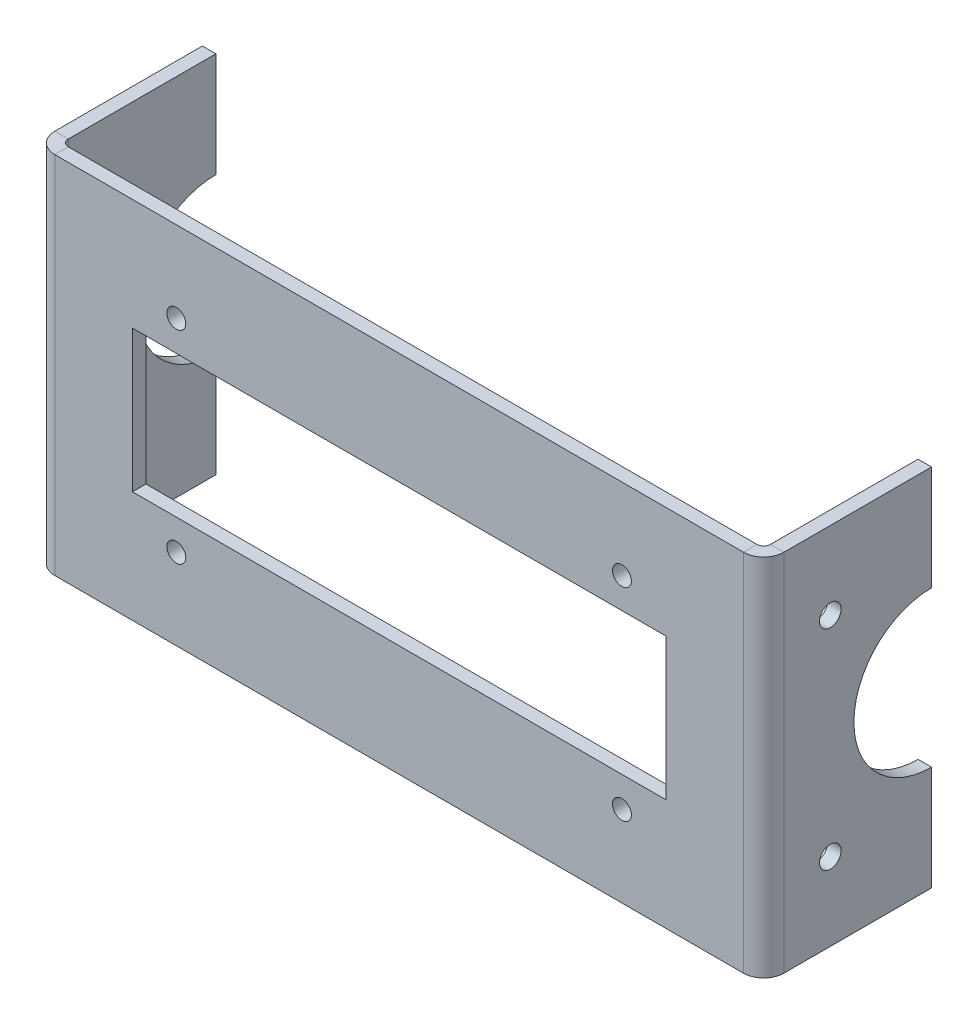
ISO-10303-21;
HEADER;
FILE_DESCRIPTION(('STEP AP214'),'2;1');
FILE_NAME('part.step','',(''),(''),'','','');
FILE_SCHEMA(('AUTOMOTIVE_DESIGN { 1 0 10303 214 1 1 1 1 }'));
ENDSEC;
DATA;
#1=APPLICATION_CONTEXT('core data for automotive mechanical design processes');
#2=APPLICATION_PROTOCOL_DEFINITION('international standard','automotive_design',2000,#1);
#3=PRODUCT_CONTEXT('',#1,'mechanical');
#4=PRODUCT('Part','Part','',(#3));
#5=PRODUCT_RELATED_PRODUCT_CATEGORY('part','',(#4));
#6=PRODUCT_DEFINITION_FORMATION('','',#4);
#7=PRODUCT_DEFINITION_CONTEXT('part definition',#1,'design');
#8=PRODUCT_DEFINITION('design','',#6,#7);
#9=PRODUCT_DEFINITION_SHAPE('','',#8);
#10=(LENGTH_UNIT() NAMED_UNIT(*) SI_UNIT(.MILLI.,.METRE.));
#11=(NAMED_UNIT(*) PLANE_ANGLE_UNIT() SI_UNIT($,.RADIAN.));
#12=(NAMED_UNIT(*) SI_UNIT($,.STERADIAN.) SOLID_ANGLE_UNIT());
#13=UNCERTAINTY_MEASURE_WITH_UNIT(LENGTH_MEASURE(1.E-05),#10,'distance_accuracy_value','');
#14=(GEOMETRIC_REPRESENTATION_CONTEXT(3) GLOBAL_UNCERTAINTY_ASSIGNED_CONTEXT((#13)) GLOBAL_UNIT_ASSIGNED_CONTEXT((#10,
#11,#12)) REPRESENTATION_CONTEXT('',''));
#15=CARTESIAN_POINT('',(0.,0.,0.));
#16=DIRECTION('',(0.,0.,1.));
#17=DIRECTION('',(1.,0.,0.));
#18=AXIS2_PLACEMENT_3D('',#15,#16,#17);
#19=CARTESIAN_POINT('',(74.4681720297526,-26.0653851394223,2.));
#20=DIRECTION('',(0.,1.,0.));
#21=DIRECTION('',(1.,0.,0.));
#22=AXIS2_PLACEMENT_3D('',#19,#20,#21);
#23=PLANE('',#22);
#24=DIRECTION('',(1.,0.,0.));
#25=VECTOR('',#24,1.);
#26=CARTESIAN_POINT('',(74.4681720297526,-26.0653851394223,2.));
#27=LINE('',#26,#25);
#28=CARTESIAN_POINT('',(-52.5318279702474,-26.0653851394223,2.));
#29=VERTEX_POINT('',#28);
#30=CARTESIAN_POINT('',(49.4681720297526,-26.0653851394223,2.));
#31=VERTEX_POINT('',#30);
#32=EDGE_CURVE('E49',#29,#31,#27,.T.);
#33=ORIENTED_EDGE('',*,*,#32,.F.);
#34=DIRECTION('',(0.,0.,-1.));
#35=VECTOR('',#34,1.);
#36=CARTESIAN_POINT('',(-52.5318279702474,-26.0653851394223,2.));
#37=LINE('',#36,#35);
#38=CARTESIAN_POINT('',(-52.5318279702474,-26.0653851394223,0.));
#39=VERTEX_POINT('',#38);
#40=EDGE_CURVE('E12',#29,#39,#37,.T.);
#41=ORIENTED_EDGE('',*,*,#40,.T.);
#42=DIRECTION('',(-1.,0.,0.));
#43=VECTOR('',#42,1.);
#44=CARTESIAN_POINT('',(-77.5318279702473,-26.0653851394223,0.));
#45=LINE('',#44,#43);
#46=CARTESIAN_POINT('',(49.4681720297526,-26.0653851394223,0.));
#47=VERTEX_POINT('',#46);
#48=EDGE_CURVE('E246',#39,#47,#45,.F.);
#49=ORIENTED_EDGE('',*,*,#48,.T.);
#50=DIRECTION('',(0.,0.,-1.));
#51=VECTOR('',#50,1.);
#52=CARTESIAN_POINT('',(49.4681720297526,-26.0653851394223,2.));
#53=LINE('',#52,#51);
#54=EDGE_CURVE('E238',#31,#47,#53,.T.);
#55=ORIENTED_EDGE('',*,*,#54,.F.);
#56=EDGE_LOOP('',(#33,#41,#49,#55));
#57=FACE_BOUND('',#56,.T.);
#58=ADVANCED_FACE('F46',(#57),#23,.F.);
#59=CARTESIAN_POINT('',(-77.5318279702473,0.934614860577672,0.));
#60=DIRECTION('',(0.,0.,-1.));
#61=DIRECTION('',(-1.,0.,0.));
#62=AXIS2_PLACEMENT_3D('',#59,#60,#61);
#63=PLANE('',#62);
#64=CARTESIAN_POINT('',(31.4681720297527,-14.0653851394223,0.));
#65=DIRECTION('',(0.,0.,1.));
#66=DIRECTION('',(1.,0.,0.));
#67=AXIS2_PLACEMENT_3D('',#64,#65,#66);
#68=CIRCLE('',#67,1.4);
#69=CARTESIAN_POINT('',(32.8681720297527,-14.0653851394223,0.));
#70=VERTEX_POINT('',#69);
#71=EDGE_CURVE('E243',#70,#70,#68,.T.);
#72=ORIENTED_EDGE('',*,*,#71,.T.);
#73=EDGE_LOOP('',(#72));
#74=FACE_BOUND('',#73,.T.);
#75=CARTESIAN_POINT('',(-34.5318279702473,-14.0653851394223,0.));
#76=DIRECTION('',(0.,0.,1.));
#77=DIRECTION('',(1.,0.,0.));
#78=AXIS2_PLACEMENT_3D('',#75,#76,#77);
#79=CIRCLE('',#78,1.4);
#80=CARTESIAN_POINT('',(-33.1318279702473,-14.0653851394223,0.));
#81=VERTEX_POINT('',#80);
#82=EDGE_CURVE('E247',#81,#81,#79,.T.);
#83=ORIENTED_EDGE('',*,*,#82,.T.);
#84=EDGE_LOOP('',(#83));
#85=FACE_BOUND('',#84,.T.);
#86=CARTESIAN_POINT('',(31.4681720297526,15.9346148605777,0.));
#87=DIRECTION('',(0.,0.,1.));
#88=DIRECTION('',(1.,0.,0.));
#89=AXIS2_PLACEMENT_3D('',#86,#87,#88);
#90=CIRCLE('',#89,1.4);
#91=CARTESIAN_POINT('',(32.8681720297526,15.9346148605777,0.));
#92=VERTEX_POINT('',#91);
#93=EDGE_CURVE('E250',#92,#92,#90,.T.);
#94=ORIENTED_EDGE('',*,*,#93,.T.);
#95=EDGE_LOOP('',(#94));
#96=FACE_BOUND('',#95,.T.);
#97=CARTESIAN_POINT('',(-34.5318279702474,15.9346148605777,0.));
#98=DIRECTION('',(0.,0.,1.));
#99=DIRECTION('',(1.,0.,0.));
#100=AXIS2_PLACEMENT_3D('',#97,#98,#99);
#101=CIRCLE('',#100,1.4);
#102=CARTESIAN_POINT('',(-33.1318279702474,15.9346148605777,0.));
#103=VERTEX_POINT('',#102);
#104=EDGE_CURVE('E253',#103,#103,#101,.T.);
#105=ORIENTED_EDGE('',*,*,#104,.T.);
#106=EDGE_LOOP('',(#105));
#107=FACE_BOUND('',#106,.T.);
#108=DIRECTION('',(-1.,0.,0.));
#109=VECTOR('',#108,1.);
#110=CARTESIAN_POINT('',(-77.5318279702473,11.4346148605777,0.));
#111=LINE('',#110,#109);
#112=CARTESIAN_POINT('',(37.9681720297526,11.4346148605777,0.));
#113=VERTEX_POINT('',#112);
#114=CARTESIAN_POINT('',(-41.0318279702474,11.4346148605777,0.));
#115=VERTEX_POINT('',#114);
#116=EDGE_CURVE('E265',#113,#115,#111,.T.);
#117=ORIENTED_EDGE('',*,*,#116,.T.);
#118=DIRECTION('',(0.,1.,0.));
#119=VECTOR('',#118,1.);
#120=CARTESIAN_POINT('',(-41.0318279702474,0.934614860577672,0.));
#121=LINE('',#120,#119);
#122=CARTESIAN_POINT('',(-41.0318279702474,-9.56538513942234,0.));
#123=VERTEX_POINT('',#122);
#124=EDGE_CURVE('E262',#115,#123,#121,.F.);
#125=ORIENTED_EDGE('',*,*,#124,.T.);
#126=DIRECTION('',(-1.,0.,0.));
#127=VECTOR('',#126,1.);
#128=CARTESIAN_POINT('',(-77.5318279702473,-9.56538513942234,0.));
#129=LINE('',#128,#127);
#130=CARTESIAN_POINT('',(37.9681720297526,-9.56538513942234,0.));
#131=VERTEX_POINT('',#130);
#132=EDGE_CURVE('E259',#123,#131,#129,.F.);
#133=ORIENTED_EDGE('',*,*,#132,.T.);
#134=DIRECTION('',(0.,1.,0.));
#135=VECTOR('',#134,1.);
#136=CARTESIAN_POINT('',(37.9681720297526,0.934614860577672,0.));
#137=LINE('',#136,#135);
#138=EDGE_CURVE('E256',#131,#113,#137,.T.);
#139=ORIENTED_EDGE('',*,*,#138,.T.);
#140=EDGE_LOOP('',(#117,#125,#133,#139));
#141=FACE_BOUND('',#140,.T.);
#142=ORIENTED_EDGE('',*,*,#48,.F.);
#143=DIRECTION('',(0.,1.,0.));
#144=VECTOR('',#143,1.);
#145=CARTESIAN_POINT('',(-52.5318279702474,0.934614860577669,0.));
#146=LINE('',#145,#144);
#147=CARTESIAN_POINT('',(-52.5318279702474,27.9346148605777,0.));
#148=VERTEX_POINT('',#147);
#149=EDGE_CURVE('E54',#39,#148,#146,.T.);
#150=ORIENTED_EDGE('',*,*,#149,.T.);
#151=DIRECTION('',(-1.,0.,0.));
#152=VECTOR('',#151,1.);
#153=CARTESIAN_POINT('',(-77.5318279702473,27.9346148605777,0.));
#154=LINE('',#153,#152);
#155=CARTESIAN_POINT('',(49.4681720297526,27.9346148605777,0.));
#156=VERTEX_POINT('',#155);
#157=EDGE_CURVE('E268',#156,#148,#154,.T.);
#158=ORIENTED_EDGE('',*,*,#157,.F.);
#159=DIRECTION('',(0.,1.,0.));
#160=VECTOR('',#159,1.);
#161=CARTESIAN_POINT('',(49.4681720297526,0.934614860577656,0.));
#162=LINE('',#161,#160);
#163=EDGE_CURVE('E308',#47,#156,#162,.T.);
#164=ORIENTED_EDGE('',*,*,#163,.F.);
#165=EDGE_LOOP('',(#142,#150,#158,#164));
#166=FACE_BOUND('',#165,.T.);
#167=ADVANCED_FACE('F397',(#74,#85,#96,#107,#141,#166),#63,.T.);
#168=CARTESIAN_POINT('',(74.4681720297526,27.9346148605777,2.));
#169=DIRECTION('',(0.,-1.,0.));
#170=DIRECTION('',(-1.,0.,0.));
#171=AXIS2_PLACEMENT_3D('',#168,#169,#170);
#172=PLANE('',#171);
#173=ORIENTED_EDGE('',*,*,#157,.T.);
#174=DIRECTION('',(0.,0.,1.));
#175=VECTOR('',#174,1.);
#176=CARTESIAN_POINT('',(-52.5318279702474,27.9346148605777,2.));
#177=LINE('',#176,#175);
#178=CARTESIAN_POINT('',(-52.5318279702474,27.9346148605777,2.));
#179=VERTEX_POINT('',#178);
#180=EDGE_CURVE('E371',#148,#179,#177,.T.);
#181=ORIENTED_EDGE('',*,*,#180,.T.);
#182=DIRECTION('',(-1.,0.,0.));
#183=VECTOR('',#182,1.);
#184=CARTESIAN_POINT('',(74.4681720297526,27.9346148605777,2.));
#185=LINE('',#184,#183);
#186=CARTESIAN_POINT('',(49.4681720297526,27.9346148605777,2.));
#187=VERTEX_POINT('',#186);
#188=EDGE_CURVE('E272',#187,#179,#185,.T.);
#189=ORIENTED_EDGE('',*,*,#188,.F.);
#190=DIRECTION('',(0.,0.,1.));
#191=VECTOR('',#190,1.);
#192=CARTESIAN_POINT('',(49.4681720297526,27.9346148605777,2.));
#193=LINE('',#192,#191);
#194=EDGE_CURVE('E305',#156,#187,#193,.T.);
#195=ORIENTED_EDGE('',*,*,#194,.F.);
#196=EDGE_LOOP('',(#173,#181,#189,#195));
#197=FACE_BOUND('',#196,.T.);
#198=ADVANCED_FACE('F387',(#197),#172,.F.);
#199=CARTESIAN_POINT('',(52.4681720297525,-26.0653851394223,-22.8584073464102));
#200=DIRECTION('',(0.,1.,0.));
#201=DIRECTION('',(0.,0.,-1.));
#202=AXIS2_PLACEMENT_3D('',#199,#200,#201);
#203=PLANE('',#202);
#204=DIRECTION('',(0.,0.,-1.));
#205=VECTOR('',#204,1.);
#206=CARTESIAN_POINT('',(52.4681720297525,-26.0653851394223,-22.8584073464102));
#207=LINE('',#206,#205);
#208=CARTESIAN_POINT('',(52.4681720297526,-26.0653851394223,-1.00000000000001));
#209=VERTEX_POINT('',#208);
#210=CARTESIAN_POINT('',(52.4681720297525,-26.0653851394223,-22.8584073464102));
#211=VERTEX_POINT('',#210);
#212=EDGE_CURVE('E320',#209,#211,#207,.T.);
#213=ORIENTED_EDGE('',*,*,#212,.F.);
#214=DIRECTION('',(-1.,0.,0.));
#215=VECTOR('',#214,1.);
#216=CARTESIAN_POINT('',(52.4681720297526,-26.0653851394223,-1.00000000000001));
#217=LINE('',#216,#215);
#218=CARTESIAN_POINT('',(50.4681720297526,-26.0653851394223,-1.00000000000001));
#219=VERTEX_POINT('',#218);
#220=EDGE_CURVE('E362',#209,#219,#217,.T.);
#221=ORIENTED_EDGE('',*,*,#220,.T.);
#222=DIRECTION('',(0.,0.,1.));
#223=VECTOR('',#222,1.);
#224=CARTESIAN_POINT('',(50.4681720297531,-26.0653851394223,129.14159265359));
#225=LINE('',#224,#223);
#226=CARTESIAN_POINT('',(50.4681720297525,-26.0653851394223,-22.8584073464102));
#227=VERTEX_POINT('',#226);
#228=EDGE_CURVE('E70',#219,#227,#225,.F.);
#229=ORIENTED_EDGE('',*,*,#228,.T.);
#230=DIRECTION('',(1.,0.,0.));
#231=VECTOR('',#230,1.);
#232=CARTESIAN_POINT('',(52.4681720297525,-26.0653851394223,-22.8584073464102));
#233=LINE('',#232,#231);
#234=EDGE_CURVE('E352',#227,#211,#233,.T.);
#235=ORIENTED_EDGE('',*,*,#234,.T.);
#236=EDGE_LOOP('',(#213,#221,#229,#235));
#237=FACE_BOUND('',#236,.T.);
#238=ADVANCED_FACE('F471',(#237),#203,.F.);
#239=CARTESIAN_POINT('',(52.4681720297525,27.9346148605777,-22.8584073464102));
#240=DIRECTION('',(0.,-1.,0.));
#241=DIRECTION('',(0.,0.,1.));
#242=AXIS2_PLACEMENT_3D('',#239,#240,#241);
#243=PLANE('',#242);
#244=DIRECTION('',(0.,0.,1.));
#245=VECTOR('',#244,1.);
#246=CARTESIAN_POINT('',(50.4681720297531,27.9346148605777,129.14159265359));
#247=LINE('',#246,#245);
#248=CARTESIAN_POINT('',(50.4681720297525,27.9346148605777,-22.8584073464102));
#249=VERTEX_POINT('',#248);
#250=CARTESIAN_POINT('',(50.4681720297526,27.9346148605777,-1.));
#251=VERTEX_POINT('',#250);
#252=EDGE_CURVE('E317',#249,#251,#247,.T.);
#253=ORIENTED_EDGE('',*,*,#252,.T.);
#254=DIRECTION('',(1.,0.,0.));
#255=VECTOR('',#254,1.);
#256=CARTESIAN_POINT('',(52.4681720297526,27.9346148605777,-1.00000000000001));
#257=LINE('',#256,#255);
#258=CARTESIAN_POINT('',(52.4681720297526,27.9346148605777,-0.999999999999998));
#259=VERTEX_POINT('',#258);
#260=EDGE_CURVE('E358',#251,#259,#257,.T.);
#261=ORIENTED_EDGE('',*,*,#260,.T.);
#262=DIRECTION('',(0.,0.,1.));
#263=VECTOR('',#262,1.);
#264=CARTESIAN_POINT('',(52.4681720297525,27.9346148605777,-22.8584073464102));
#265=LINE('',#264,#263);
#266=CARTESIAN_POINT('',(52.4681720297525,27.9346148605777,-22.8584073464102));
#267=VERTEX_POINT('',#266);
#268=EDGE_CURVE('E330',#267,#259,#265,.T.);
#269=ORIENTED_EDGE('',*,*,#268,.F.);
#270=DIRECTION('',(1.,0.,0.));
#271=VECTOR('',#270,1.);
#272=CARTESIAN_POINT('',(52.4681720297525,27.9346148605777,-22.8584073464102));
#273=LINE('',#272,#271);
#274=EDGE_CURVE('E346',#249,#267,#273,.T.);
#275=ORIENTED_EDGE('',*,*,#274,.F.);
#276=EDGE_LOOP('',(#253,#261,#269,#275));
#277=FACE_BOUND('',#276,.T.);
#278=ADVANCED_FACE('F481',(#277),#243,.F.);
#279=CARTESIAN_POINT('',(50.4681720297531,0.934614860577655,129.14159265359));
#280=DIRECTION('',(-1.,0.,0.));
#281=DIRECTION('',(0.,0.,1.));
#282=AXIS2_PLACEMENT_3D('',#279,#280,#281);
#283=PLANE('',#282);
#284=CARTESIAN_POINT('',(50.4681720297526,16.4346148605777,-7.85840734641021));
#285=DIRECTION('',(1.,0.,0.));
#286=DIRECTION('',(0.,0.,-1.));
#287=AXIS2_PLACEMENT_3D('',#284,#285,#286);
#288=CIRCLE('',#287,1.59999999999998);
#289=CARTESIAN_POINT('',(50.4681720297526,16.4346148605777,-9.4584073464102));
#290=VERTEX_POINT('',#289);
#291=EDGE_CURVE('E334',#290,#290,#288,.T.);
#292=ORIENTED_EDGE('',*,*,#291,.T.);
#293=EDGE_LOOP('',(#292));
#294=FACE_BOUND('',#293,.T.);
#295=CARTESIAN_POINT('',(50.4681720297526,-14.5653851394223,-7.85840734641021));
#296=DIRECTION('',(1.,0.,0.));
#297=DIRECTION('',(0.,0.,-1.));
#298=AXIS2_PLACEMENT_3D('',#295,#296,#297);
#299=CIRCLE('',#298,1.6);
#300=CARTESIAN_POINT('',(50.4681720297526,-14.5653851394223,-9.45840734641021));
#301=VERTEX_POINT('',#300);
#302=EDGE_CURVE('E331',#301,#301,#299,.T.);
#303=ORIENTED_EDGE('',*,*,#302,.T.);
#304=EDGE_LOOP('',(#303));
#305=FACE_BOUND('',#304,.T.);
#306=ORIENTED_EDGE('',*,*,#228,.F.);
#307=DIRECTION('',(0.,1.,0.));
#308=VECTOR('',#307,1.);
#309=CARTESIAN_POINT('',(50.4681720297526,0.934614860577655,-1.00000000000001));
#310=LINE('',#309,#308);
#311=EDGE_CURVE('E360',#219,#251,#310,.T.);
#312=ORIENTED_EDGE('',*,*,#311,.T.);
#313=ORIENTED_EDGE('',*,*,#252,.F.);
#314=DIRECTION('',(0.,1.,0.));
#315=VECTOR('',#314,1.);
#316=CARTESIAN_POINT('',(50.4681720297525,0.934614860577675,-22.8584073464102));
#317=LINE('',#316,#315);
#318=CARTESIAN_POINT('',(50.4681720297525,12.4346148605777,-22.8584073464102));
#319=VERTEX_POINT('',#318);
#320=EDGE_CURVE('E337',#319,#249,#317,.T.);
#321=ORIENTED_EDGE('',*,*,#320,.F.);
#322=CARTESIAN_POINT('',(50.4681720297525,0.934614860577673,-22.8584073464102));
#323=DIRECTION('',(-1.,0.,0.));
#324=DIRECTION('',(0.,0.,1.));
#325=AXIS2_PLACEMENT_3D('',#322,#323,#324);
#326=CIRCLE('',#325,11.5);
#327=CARTESIAN_POINT('',(50.4681720297525,-10.5653851394223,-22.8584073464102));
#328=VERTEX_POINT('',#327);
#329=EDGE_CURVE('E340',#328,#319,#326,.T.);
#330=ORIENTED_EDGE('',*,*,#329,.F.);
#331=DIRECTION('',(0.,1.,0.));
#332=VECTOR('',#331,1.);
#333=CARTESIAN_POINT('',(50.4681720297525,0.934614860577675,-22.8584073464102));
#334=LINE('',#333,#332);
#335=EDGE_CURVE('E343',#227,#328,#334,.T.);
#336=ORIENTED_EDGE('',*,*,#335,.F.);
#337=EDGE_LOOP('',(#306,#312,#313,#321,#330,#336));
#338=FACE_BOUND('',#337,.T.);
#339=ADVANCED_FACE('F483',(#294,#305,#338),#283,.T.);
#340=CARTESIAN_POINT('',(52.4681720297525,-10.5653851394223,-22.8584073464102));
#341=DIRECTION('',(0.,0.,1.));
#342=DIRECTION('',(0.,1.,0.));
#343=AXIS2_PLACEMENT_3D('',#340,#341,#342);
#344=PLANE('',#343);
#345=ORIENTED_EDGE('',*,*,#234,.F.);
#346=ORIENTED_EDGE('',*,*,#335,.T.);
#347=DIRECTION('',(1.,0.,0.));
#348=VECTOR('',#347,1.);
#349=CARTESIAN_POINT('',(52.4681720297525,-10.5653851394223,-22.8584073464102));
#350=LINE('',#349,#348);
#351=CARTESIAN_POINT('',(52.4681720297525,-10.5653851394223,-22.8584073464102));
#352=VERTEX_POINT('',#351);
#353=EDGE_CURVE('E350',#328,#352,#350,.T.);
#354=ORIENTED_EDGE('',*,*,#353,.T.);
#355=DIRECTION('',(0.,1.,0.));
#356=VECTOR('',#355,1.);
#357=CARTESIAN_POINT('',(52.4681720297525,-10.5653851394223,-22.8584073464102));
#358=LINE('',#357,#356);
#359=EDGE_CURVE('E321',#211,#352,#358,.T.);
#360=ORIENTED_EDGE('',*,*,#359,.F.);
#361=EDGE_LOOP('',(#345,#346,#354,#360));
#362=FACE_BOUND('',#361,.T.);
#363=ADVANCED_FACE('F486',(#362),#344,.F.);
#364=CARTESIAN_POINT('',(52.4681720297525,0.934614860577673,-22.8584073464102));
#365=DIRECTION('',(-1.,0.,0.));
#366=DIRECTION('',(0.,0.,1.));
#367=AXIS2_PLACEMENT_3D('',#364,#365,#366);
#368=CYLINDRICAL_SURFACE('',#367,11.5);
#369=ORIENTED_EDGE('',*,*,#353,.F.);
#370=ORIENTED_EDGE('',*,*,#329,.T.);
#371=DIRECTION('',(1.,0.,0.));
#372=VECTOR('',#371,1.);
#373=CARTESIAN_POINT('',(52.4681720297525,12.4346148605777,-22.8584073464102));
#374=LINE('',#373,#372);
#375=CARTESIAN_POINT('',(52.4681720297525,12.4346148605777,-22.8584073464102));
#376=VERTEX_POINT('',#375);
#377=EDGE_CURVE('E348',#319,#376,#374,.T.);
#378=ORIENTED_EDGE('',*,*,#377,.T.);
#379=CARTESIAN_POINT('',(52.4681720297525,0.934614860577673,-22.8584073464102));
#380=DIRECTION('',(-1.,0.,0.));
#381=DIRECTION('',(0.,0.,-1.));
#382=AXIS2_PLACEMENT_3D('',#379,#380,#381);
#383=CIRCLE('',#382,11.5);
#384=EDGE_CURVE('E324',#352,#376,#383,.T.);
#385=ORIENTED_EDGE('',*,*,#384,.F.);
#386=EDGE_LOOP('',(#369,#370,#378,#385));
#387=FACE_BOUND('',#386,.T.);
#388=ADVANCED_FACE('F499',(#387),#368,.F.);
#389=CARTESIAN_POINT('',(52.4681720297525,27.9346148605777,-22.8584073464102));
#390=DIRECTION('',(0.,0.,1.));
#391=DIRECTION('',(0.,1.,0.));
#392=AXIS2_PLACEMENT_3D('',#389,#390,#391);
#393=PLANE('',#392);
#394=ORIENTED_EDGE('',*,*,#377,.F.);
#395=ORIENTED_EDGE('',*,*,#320,.T.);
#396=ORIENTED_EDGE('',*,*,#274,.T.);
#397=DIRECTION('',(0.,1.,0.));
#398=VECTOR('',#397,1.);
#399=CARTESIAN_POINT('',(52.4681720297525,27.9346148605777,-22.8584073464102));
#400=LINE('',#399,#398);
#401=EDGE_CURVE('E327',#376,#267,#400,.T.);
#402=ORIENTED_EDGE('',*,*,#401,.F.);
#403=EDGE_LOOP('',(#394,#395,#396,#402));
#404=FACE_BOUND('',#403,.T.);
#405=ADVANCED_FACE('F503',(#404),#393,.F.);
#406=CARTESIAN_POINT('',(52.4681720297526,-14.5653851394223,-7.85840734641022));
#407=DIRECTION('',(1.,0.,0.));
#408=DIRECTION('',(0.,0.,-1.));
#409=AXIS2_PLACEMENT_3D('',#406,#407,#408);
#410=CYLINDRICAL_SURFACE('',#409,1.6);
#411=CARTESIAN_POINT('',(52.4681720297526,-14.5653851394223,-7.85840734641022));
#412=DIRECTION('',(1.,0.,0.));
#413=DIRECTION('',(0.,0.,-1.));
#414=AXIS2_PLACEMENT_3D('',#411,#412,#413);
#415=CIRCLE('',#414,1.6);
#416=CARTESIAN_POINT('',(52.4681720297526,-14.5653851394223,-9.45840734641022));
#417=VERTEX_POINT('',#416);
#418=EDGE_CURVE('E313',#417,#417,#415,.T.);
#419=ORIENTED_EDGE('',*,*,#418,.T.);
#420=EDGE_LOOP('',(#419));
#421=FACE_BOUND('',#420,.T.);
#422=ORIENTED_EDGE('',*,*,#302,.F.);
#423=EDGE_LOOP('',(#422));
#424=FACE_BOUND('',#423,.T.);
#425=ADVANCED_FACE('F507',(#421,#424),#410,.F.);
#426=CARTESIAN_POINT('',(52.4681720297526,16.4346148605777,-7.85840734641022));
#427=DIRECTION('',(1.,0.,0.));
#428=DIRECTION('',(0.,0.,-1.));
#429=AXIS2_PLACEMENT_3D('',#426,#427,#428);
#430=CYLINDRICAL_SURFACE('',#429,1.59999999999998);
#431=CARTESIAN_POINT('',(52.4681720297526,16.4346148605777,-7.85840734641022));
#432=DIRECTION('',(1.,0.,0.));
#433=DIRECTION('',(0.,0.,-1.));
#434=AXIS2_PLACEMENT_3D('',#431,#432,#433);
#435=CIRCLE('',#434,1.59999999999998);
#436=CARTESIAN_POINT('',(52.4681720297526,16.4346148605777,-9.4584073464102));
#437=VERTEX_POINT('',#436);
#438=EDGE_CURVE('E316',#437,#437,#435,.T.);
#439=ORIENTED_EDGE('',*,*,#438,.T.);
#440=EDGE_LOOP('',(#439));
#441=FACE_BOUND('',#440,.T.);
#442=ORIENTED_EDGE('',*,*,#291,.F.);
#443=EDGE_LOOP('',(#442));
#444=FACE_BOUND('',#443,.T.);
#445=ADVANCED_FACE('F495',(#441,#444),#430,.F.);
#446=CARTESIAN_POINT('',(52.4681720297531,0.934614860577655,129.14159265359));
#447=DIRECTION('',(-1.,0.,0.));
#448=DIRECTION('',(0.,0.,1.));
#449=AXIS2_PLACEMENT_3D('',#446,#447,#448);
#450=PLANE('',#449);
#451=DIRECTION('',(0.,1.,0.));
#452=VECTOR('',#451,1.);
#453=CARTESIAN_POINT('',(52.4681720297526,0.934614860577655,-1.00000000000001));
#454=LINE('',#453,#452);
#455=EDGE_CURVE('E355',#209,#259,#454,.T.);
#456=ORIENTED_EDGE('',*,*,#455,.F.);
#457=ORIENTED_EDGE('',*,*,#212,.T.);
#458=ORIENTED_EDGE('',*,*,#359,.T.);
#459=ORIENTED_EDGE('',*,*,#384,.T.);
#460=ORIENTED_EDGE('',*,*,#401,.T.);
#461=ORIENTED_EDGE('',*,*,#268,.T.);
#462=EDGE_LOOP('',(#456,#457,#458,#459,#460,#461));
#463=FACE_BOUND('',#462,.T.);
#464=ORIENTED_EDGE('',*,*,#418,.F.);
#465=EDGE_LOOP('',(#464));
#466=FACE_BOUND('',#465,.T.);
#467=ORIENTED_EDGE('',*,*,#438,.F.);
#468=EDGE_LOOP('',(#467));
#469=FACE_BOUND('',#468,.T.);
#470=ADVANCED_FACE('F491',(#463,#466,#469),#450,.F.);
#471=CARTESIAN_POINT('',(-41.0318279702474,11.4346148605777,2.));
#472=DIRECTION('',(1.,0.,0.));
#473=DIRECTION('',(0.,-1.,0.));
#474=AXIS2_PLACEMENT_3D('',#471,#472,#473);
#475=PLANE('',#474);
#476=DIRECTION('',(0.,0.,1.));
#477=VECTOR('',#476,1.);
#478=CARTESIAN_POINT('',(-41.0318279702474,-9.56538513942234,2.));
#479=LINE('',#478,#477);
#480=CARTESIAN_POINT('',(-41.0318279702474,-9.56538513942234,2.));
#481=VERTEX_POINT('',#480);
#482=EDGE_CURVE('E298',#123,#481,#479,.T.);
#483=ORIENTED_EDGE('',*,*,#482,.F.);
#484=ORIENTED_EDGE('',*,*,#124,.F.);
#485=DIRECTION('',(0.,0.,1.));
#486=VECTOR('',#485,1.);
#487=CARTESIAN_POINT('',(-41.0318279702474,11.4346148605777,2.));
#488=LINE('',#487,#486);
#489=CARTESIAN_POINT('',(-41.0318279702474,11.4346148605777,2.));
#490=VERTEX_POINT('',#489);
#491=EDGE_CURVE('E303',#115,#490,#488,.T.);
#492=ORIENTED_EDGE('',*,*,#491,.T.);
#493=DIRECTION('',(0.,-1.,0.));
#494=VECTOR('',#493,1.);
#495=CARTESIAN_POINT('',(-41.0318279702474,11.4346148605777,2.));
#496=LINE('',#495,#494);
#497=EDGE_CURVE('E300',#490,#481,#496,.T.);
#498=ORIENTED_EDGE('',*,*,#497,.T.);
#499=EDGE_LOOP('',(#483,#484,#492,#498));
#500=FACE_BOUND('',#499,.T.);
#501=ADVANCED_FACE('F494',(#500),#475,.T.);
#502=CARTESIAN_POINT('',(-41.0318279702474,-9.56538513942234,2.));
#503=DIRECTION('',(0.,1.,0.));
#504=DIRECTION('',(1.,0.,0.));
#505=AXIS2_PLACEMENT_3D('',#502,#503,#504);
#506=PLANE('',#505);
#507=DIRECTION('',(0.,0.,1.));
#508=VECTOR('',#507,1.);
#509=CARTESIAN_POINT('',(37.9681720297526,-9.56538513942234,2.));
#510=LINE('',#509,#508);
#511=CARTESIAN_POINT('',(37.9681720297526,-9.56538513942234,2.));
#512=VERTEX_POINT('',#511);
#513=EDGE_CURVE('E293',#131,#512,#510,.T.);
#514=ORIENTED_EDGE('',*,*,#513,.F.);
#515=ORIENTED_EDGE('',*,*,#132,.F.);
#516=ORIENTED_EDGE('',*,*,#482,.T.);
#517=DIRECTION('',(1.,0.,0.));
#518=VECTOR('',#517,1.);
#519=CARTESIAN_POINT('',(-41.0318279702474,-9.56538513942234,2.));
#520=LINE('',#519,#518);
#521=EDGE_CURVE('E295',#481,#512,#520,.T.);
#522=ORIENTED_EDGE('',*,*,#521,.T.);
#523=EDGE_LOOP('',(#514,#515,#516,#522));
#524=FACE_BOUND('',#523,.T.);
#525=ADVANCED_FACE('F537',(#524),#506,.T.);
#526=CARTESIAN_POINT('',(37.9681720297526,11.4346148605777,2.));
#527=DIRECTION('',(-1.,0.,0.));
#528=DIRECTION('',(0.,1.,0.));
#529=AXIS2_PLACEMENT_3D('',#526,#527,#528);
#530=PLANE('',#529);
#531=ORIENTED_EDGE('',*,*,#138,.F.);
#532=ORIENTED_EDGE('',*,*,#513,.T.);
#533=DIRECTION('',(0.,1.,0.));
#534=VECTOR('',#533,1.);
#535=CARTESIAN_POINT('',(37.9681720297526,11.4346148605777,2.));
#536=LINE('',#535,#534);
#537=CARTESIAN_POINT('',(37.9681720297526,11.4346148605777,2.));
#538=VERTEX_POINT('',#537);
#539=EDGE_CURVE('E290',#512,#538,#536,.T.);
#540=ORIENTED_EDGE('',*,*,#539,.T.);
#541=DIRECTION('',(0.,0.,1.));
#542=VECTOR('',#541,1.);
#543=CARTESIAN_POINT('',(37.9681720297526,11.4346148605777,2.));
#544=LINE('',#543,#542);
#545=EDGE_CURVE('E288',#113,#538,#544,.T.);
#546=ORIENTED_EDGE('',*,*,#545,.F.);
#547=EDGE_LOOP('',(#531,#532,#540,#546));
#548=FACE_BOUND('',#547,.T.);
#549=ADVANCED_FACE('F533',(#548),#530,.T.);
#550=CARTESIAN_POINT('',(-41.0318279702474,11.4346148605777,2.));
#551=DIRECTION('',(0.,-1.,0.));
#552=DIRECTION('',(-1.,0.,0.));
#553=AXIS2_PLACEMENT_3D('',#550,#551,#552);
#554=PLANE('',#553);
#555=ORIENTED_EDGE('',*,*,#491,.F.);
#556=ORIENTED_EDGE('',*,*,#116,.F.);
#557=ORIENTED_EDGE('',*,*,#545,.T.);
#558=DIRECTION('',(-1.,0.,0.));
#559=VECTOR('',#558,1.);
#560=CARTESIAN_POINT('',(-41.0318279702474,11.4346148605777,2.));
#561=LINE('',#560,#559);
#562=EDGE_CURVE('E285',#538,#490,#561,.T.);
#563=ORIENTED_EDGE('',*,*,#562,.T.);
#564=EDGE_LOOP('',(#555,#556,#557,#563));
#565=FACE_BOUND('',#564,.T.);
#566=ADVANCED_FACE('F529',(#565),#554,.T.);
#567=CARTESIAN_POINT('',(-34.5318279702474,15.9346148605777,2.));
#568=DIRECTION('',(0.,0.,1.));
#569=DIRECTION('',(1.,0.,0.));
#570=AXIS2_PLACEMENT_3D('',#567,#568,#569);
#571=CYLINDRICAL_SURFACE('',#570,1.4);
#572=CARTESIAN_POINT('',(-34.5318279702474,15.9346148605777,2.));
#573=DIRECTION('',(0.,0.,1.));
#574=DIRECTION('',(1.,0.,0.));
#575=AXIS2_PLACEMENT_3D('',#572,#573,#574);
#576=CIRCLE('',#575,1.4);
#577=CARTESIAN_POINT('',(-33.1318279702474,15.9346148605777,2.));
#578=VERTEX_POINT('',#577);
#579=EDGE_CURVE('E282',#578,#578,#576,.T.);
#580=ORIENTED_EDGE('',*,*,#579,.T.);
#581=EDGE_LOOP('',(#580));
#582=FACE_BOUND('',#581,.T.);
#583=ORIENTED_EDGE('',*,*,#104,.F.);
#584=EDGE_LOOP('',(#583));
#585=FACE_BOUND('',#584,.T.);
#586=ADVANCED_FACE('F525',(#582,#585),#571,.F.);
#587=CARTESIAN_POINT('',(31.4681720297526,15.9346148605777,2.));
#588=DIRECTION('',(0.,0.,1.));
#589=DIRECTION('',(1.,0.,0.));
#590=AXIS2_PLACEMENT_3D('',#587,#588,#589);
#591=CYLINDRICAL_SURFACE('',#590,1.4);
#592=CARTESIAN_POINT('',(31.4681720297526,15.9346148605777,2.));
#593=DIRECTION('',(0.,0.,1.));
#594=DIRECTION('',(1.,0.,0.));
#595=AXIS2_PLACEMENT_3D('',#592,#593,#594);
#596=CIRCLE('',#595,1.4);
#597=CARTESIAN_POINT('',(32.8681720297526,15.9346148605777,2.));
#598=VERTEX_POINT('',#597);
#599=EDGE_CURVE('E279',#598,#598,#596,.T.);
#600=ORIENTED_EDGE('',*,*,#599,.T.);
#601=EDGE_LOOP('',(#600));
#602=FACE_BOUND('',#601,.T.);
#603=ORIENTED_EDGE('',*,*,#93,.F.);
#604=EDGE_LOOP('',(#603));
#605=FACE_BOUND('',#604,.T.);
#606=ADVANCED_FACE('F521',(#602,#605),#591,.F.);
#607=CARTESIAN_POINT('',(-34.5318279702473,-14.0653851394223,2.));
#608=DIRECTION('',(0.,0.,1.));
#609=DIRECTION('',(1.,0.,0.));
#610=AXIS2_PLACEMENT_3D('',#607,#608,#609);
#611=CYLINDRICAL_SURFACE('',#610,1.4);
#612=CARTESIAN_POINT('',(-34.5318279702473,-14.0653851394223,2.));
#613=DIRECTION('',(0.,0.,1.));
#614=DIRECTION('',(1.,0.,0.));
#615=AXIS2_PLACEMENT_3D('',#612,#613,#614);
#616=CIRCLE('',#615,1.4);
#617=CARTESIAN_POINT('',(-33.1318279702473,-14.0653851394223,2.));
#618=VERTEX_POINT('',#617);
#619=EDGE_CURVE('E276',#618,#618,#616,.T.);
#620=ORIENTED_EDGE('',*,*,#619,.T.);
#621=EDGE_LOOP('',(#620));
#622=FACE_BOUND('',#621,.T.);
#623=ORIENTED_EDGE('',*,*,#82,.F.);
#624=EDGE_LOOP('',(#623));
#625=FACE_BOUND('',#624,.T.);
#626=ADVANCED_FACE('F517',(#622,#625),#611,.F.);
#627=CARTESIAN_POINT('',(31.4681720297527,-14.0653851394223,2.));
#628=DIRECTION('',(0.,0.,1.));
#629=DIRECTION('',(1.,0.,0.));
#630=AXIS2_PLACEMENT_3D('',#627,#628,#629);
#631=CYLINDRICAL_SURFACE('',#630,1.4);
#632=CARTESIAN_POINT('',(31.4681720297527,-14.0653851394223,2.));
#633=DIRECTION('',(0.,0.,1.));
#634=DIRECTION('',(1.,0.,0.));
#635=AXIS2_PLACEMENT_3D('',#632,#633,#634);
#636=CIRCLE('',#635,1.4);
#637=CARTESIAN_POINT('',(32.8681720297527,-14.0653851394223,2.));
#638=VERTEX_POINT('',#637);
#639=EDGE_CURVE('E273',#638,#638,#636,.T.);
#640=ORIENTED_EDGE('',*,*,#639,.T.);
#641=EDGE_LOOP('',(#640));
#642=FACE_BOUND('',#641,.T.);
#643=ORIENTED_EDGE('',*,*,#71,.F.);
#644=EDGE_LOOP('',(#643));
#645=FACE_BOUND('',#644,.T.);
#646=ADVANCED_FACE('F478',(#642,#645),#631,.F.);
#647=CARTESIAN_POINT('',(-77.5318279702473,0.934614860577672,2.));
#648=DIRECTION('',(0.,0.,-1.));
#649=DIRECTION('',(-1.,0.,0.));
#650=AXIS2_PLACEMENT_3D('',#647,#648,#649);
#651=PLANE('',#650);
#652=DIRECTION('',(0.,1.,0.));
#653=VECTOR('',#652,1.);
#654=CARTESIAN_POINT('',(-52.5318279702474,0.934614860577669,2.));
#655=LINE('',#654,#653);
#656=EDGE_CURVE('E364',#29,#179,#655,.T.);
#657=ORIENTED_EDGE('',*,*,#656,.F.);
#658=ORIENTED_EDGE('',*,*,#32,.T.);
#659=DIRECTION('',(0.,1.,0.));
#660=VECTOR('',#659,1.);
#661=CARTESIAN_POINT('',(49.4681720297526,0.934614860577656,2.));
#662=LINE('',#661,#660);
#663=EDGE_CURVE('E269',#31,#187,#662,.T.);
#664=ORIENTED_EDGE('',*,*,#663,.T.);
#665=ORIENTED_EDGE('',*,*,#188,.T.);
#666=EDGE_LOOP('',(#657,#658,#664,#665));
#667=FACE_BOUND('',#666,.T.);
#668=ORIENTED_EDGE('',*,*,#639,.F.);
#669=EDGE_LOOP('',(#668));
#670=FACE_BOUND('',#669,.T.);
#671=ORIENTED_EDGE('',*,*,#619,.F.);
#672=EDGE_LOOP('',(#671));
#673=FACE_BOUND('',#672,.T.);
#674=ORIENTED_EDGE('',*,*,#599,.F.);
#675=EDGE_LOOP('',(#674));
#676=FACE_BOUND('',#675,.T.);
#677=ORIENTED_EDGE('',*,*,#579,.F.);
#678=EDGE_LOOP('',(#677));
#679=FACE_BOUND('',#678,.T.);
#680=ORIENTED_EDGE('',*,*,#562,.F.);
#681=ORIENTED_EDGE('',*,*,#539,.F.);
#682=ORIENTED_EDGE('',*,*,#521,.F.);
#683=ORIENTED_EDGE('',*,*,#497,.F.);
#684=EDGE_LOOP('',(#680,#681,#682,#683));
#685=FACE_BOUND('',#684,.T.);
#686=ADVANCED_FACE('F381',(#667,#670,#673,#676,#679,#685),#651,.F.);
#687=CARTESIAN_POINT('',(49.4681720297526,-26.0653851394223,-1.));
#688=DIRECTION('',(0.,-1.,0.));
#689=DIRECTION('',(0.,0.,-1.));
#690=AXIS2_PLACEMENT_3D('',#687,#688,#689);
#691=PLANE('',#690);
#692=ORIENTED_EDGE('',*,*,#54,.T.);
#693=CARTESIAN_POINT('',(49.4681720297526,-26.0653851394223,-1.));
#694=DIRECTION('',(0.,1.,0.));
#695=DIRECTION('',(-1.,0.,0.));
#696=AXIS2_PLACEMENT_3D('',#693,#694,#695);
#697=CIRCLE('',#696,1.);
#698=EDGE_CURVE('E227',#47,#219,#697,.T.);
#699=ORIENTED_EDGE('',*,*,#698,.T.);
#700=ORIENTED_EDGE('',*,*,#220,.F.);
#701=CARTESIAN_POINT('',(49.4681720297526,-26.0653851394223,-1.));
#702=DIRECTION('',(0.,1.,0.));
#703=DIRECTION('',(0.,0.,1.));
#704=AXIS2_PLACEMENT_3D('',#701,#702,#703);
#705=CIRCLE('',#704,3.);
#706=EDGE_CURVE('E231',#31,#209,#705,.T.);
#707=ORIENTED_EDGE('',*,*,#706,.F.);
#708=EDGE_LOOP('',(#692,#699,#700,#707));
#709=FACE_BOUND('',#708,.T.);
#710=ADVANCED_FACE('F477',(#709),#691,.T.);
#711=CARTESIAN_POINT('',(49.4681720297526,27.9346148605777,-1.));
#712=DIRECTION('',(0.,1.,0.));
#713=DIRECTION('',(0.,0.,1.));
#714=AXIS2_PLACEMENT_3D('',#711,#712,#713);
#715=PLANE('',#714);
#716=ORIENTED_EDGE('',*,*,#260,.F.);
#717=CARTESIAN_POINT('',(49.4681720297526,27.9346148605777,-1.));
#718=DIRECTION('',(0.,1.,0.));
#719=DIRECTION('',(-1.,0.,0.));
#720=AXIS2_PLACEMENT_3D('',#717,#718,#719);
#721=CIRCLE('',#720,1.);
#722=EDGE_CURVE('E235',#251,#156,#721,.F.);
#723=ORIENTED_EDGE('',*,*,#722,.T.);
#724=ORIENTED_EDGE('',*,*,#194,.T.);
#725=CARTESIAN_POINT('',(49.4681720297526,27.9346148605777,-1.));
#726=DIRECTION('',(0.,-1.,0.));
#727=DIRECTION('',(0.,0.,-1.));
#728=AXIS2_PLACEMENT_3D('',#725,#726,#727);
#729=CIRCLE('',#728,3.);
#730=EDGE_CURVE('E234',#259,#187,#729,.T.);
#731=ORIENTED_EDGE('',*,*,#730,.F.);
#732=EDGE_LOOP('',(#716,#723,#724,#731));
#733=FACE_BOUND('',#732,.T.);
#734=ADVANCED_FACE('F547',(#733),#715,.T.);
#735=CARTESIAN_POINT('',(49.4681720297526,-53.1936550582096,-1.));
#736=DIRECTION('',(0.,1.,0.));
#737=DIRECTION('',(-1.,0.,0.));
#738=AXIS2_PLACEMENT_3D('',#735,#736,#737);
#739=CYLINDRICAL_SURFACE('',#738,3.);
#740=ORIENTED_EDGE('',*,*,#730,.T.);
#741=ORIENTED_EDGE('',*,*,#663,.F.);
#742=ORIENTED_EDGE('',*,*,#706,.T.);
#743=ORIENTED_EDGE('',*,*,#455,.T.);
#744=EDGE_LOOP('',(#740,#741,#742,#743));
#745=FACE_BOUND('',#744,.T.);
#746=ADVANCED_FACE('F551',(#745),#739,.T.);
#747=CARTESIAN_POINT('',(49.4681720297526,-53.1936550582096,-1.));
#748=DIRECTION('',(0.,1.,0.));
#749=DIRECTION('',(-1.,0.,0.));
#750=AXIS2_PLACEMENT_3D('',#747,#748,#749);
#751=CYLINDRICAL_SURFACE('',#750,1.);
#752=ORIENTED_EDGE('',*,*,#722,.F.);
#753=ORIENTED_EDGE('',*,*,#311,.F.);
#754=ORIENTED_EDGE('',*,*,#698,.F.);
#755=ORIENTED_EDGE('',*,*,#163,.T.);
#756=EDGE_LOOP('',(#752,#753,#754,#755));
#757=FACE_BOUND('',#756,.T.);
#758=ADVANCED_FACE('F553',(#757),#751,.F.);
#759=CARTESIAN_POINT('',(-52.5318279702474,-26.0653851394223,-1.));
#760=DIRECTION('',(0.,-1.,0.));
#761=DIRECTION('',(0.,0.,-1.));
#762=AXIS2_PLACEMENT_3D('',#759,#760,#761);
#763=PLANE('',#762);
#764=DIRECTION('',(1.,0.,0.));
#765=VECTOR('',#764,1.);
#766=CARTESIAN_POINT('',(-55.5318279702474,-26.0653851394223,-1.00000000000001));
#767=LINE('',#766,#765);
#768=CARTESIAN_POINT('',(-55.5318279702474,-26.0653851394223,-0.999999999999998));
#769=VERTEX_POINT('',#768);
#770=CARTESIAN_POINT('',(-53.5318279702474,-26.0653851394223,-1.));
#771=VERTEX_POINT('',#770);
#772=EDGE_CURVE('E218',#769,#771,#767,.T.);
#773=ORIENTED_EDGE('',*,*,#772,.T.);
#774=CARTESIAN_POINT('',(-52.5318279702474,-26.0653851394223,-1.));
#775=DIRECTION('',(0.,-1.,0.));
#776=DIRECTION('',(1.,0.,0.));
#777=AXIS2_PLACEMENT_3D('',#774,#775,#776);
#778=CIRCLE('',#777,1.);
#779=EDGE_CURVE('E62',#771,#39,#778,.F.);
#780=ORIENTED_EDGE('',*,*,#779,.T.);
#781=ORIENTED_EDGE('',*,*,#40,.F.);
#782=CARTESIAN_POINT('',(-52.5318279702474,-26.0653851394223,-1.));
#783=DIRECTION('',(0.,1.,0.));
#784=DIRECTION('',(0.,0.,1.));
#785=AXIS2_PLACEMENT_3D('',#782,#783,#784);
#786=CIRCLE('',#785,3.);
#787=EDGE_CURVE('E220',#769,#29,#786,.T.);
#788=ORIENTED_EDGE('',*,*,#787,.F.);
#789=EDGE_LOOP('',(#773,#780,#781,#788));
#790=FACE_BOUND('',#789,.T.);
#791=ADVANCED_FACE('F401',(#790),#763,.T.);
#792=CARTESIAN_POINT('',(-52.5318279702474,27.9346148605777,-1.));
#793=DIRECTION('',(0.,1.,0.));
#794=DIRECTION('',(0.,0.,1.));
#795=AXIS2_PLACEMENT_3D('',#792,#793,#794);
#796=PLANE('',#795);
#797=CARTESIAN_POINT('',(-52.5318279702474,27.9346148605777,-1.));
#798=DIRECTION('',(0.,-1.,0.));
#799=DIRECTION('',(1.,0.,0.));
#800=AXIS2_PLACEMENT_3D('',#797,#798,#799);
#801=CIRCLE('',#800,1.);
#802=CARTESIAN_POINT('',(-53.5318279702474,27.9346148605777,-1.00000000000001));
#803=VERTEX_POINT('',#802);
#804=EDGE_CURVE('E224',#148,#803,#801,.T.);
#805=ORIENTED_EDGE('',*,*,#804,.T.);
#806=DIRECTION('',(-1.,0.,0.));
#807=VECTOR('',#806,1.);
#808=CARTESIAN_POINT('',(-55.5318279702474,27.9346148605777,-1.));
#809=LINE('',#808,#807);
#810=CARTESIAN_POINT('',(-55.5318279702474,27.9346148605777,-1.));
#811=VERTEX_POINT('',#810);
#812=EDGE_CURVE('E211',#803,#811,#809,.T.);
#813=ORIENTED_EDGE('',*,*,#812,.T.);
#814=CARTESIAN_POINT('',(-52.5318279702474,27.9346148605777,-1.));
#815=DIRECTION('',(0.,-1.,0.));
#816=DIRECTION('',(0.,0.,-1.));
#817=AXIS2_PLACEMENT_3D('',#814,#815,#816);
#818=CIRCLE('',#817,3.);
#819=EDGE_CURVE('E223',#179,#811,#818,.T.);
#820=ORIENTED_EDGE('',*,*,#819,.F.);
#821=ORIENTED_EDGE('',*,*,#180,.F.);
#822=EDGE_LOOP('',(#805,#813,#820,#821));
#823=FACE_BOUND('',#822,.T.);
#824=ADVANCED_FACE('F391',(#823),#796,.T.);
#825=CARTESIAN_POINT('',(-52.5318279702473,55.0628847793649,-1.));
#826=DIRECTION('',(0.,-1.,0.));
#827=DIRECTION('',(1.,0.,0.));
#828=AXIS2_PLACEMENT_3D('',#825,#826,#827);
#829=CYLINDRICAL_SURFACE('',#828,3.);
#830=ORIENTED_EDGE('',*,*,#656,.T.);
#831=ORIENTED_EDGE('',*,*,#819,.T.);
#832=DIRECTION('',(0.,1.,0.));
#833=VECTOR('',#832,1.);
#834=CARTESIAN_POINT('',(-55.5318279702474,0.934614860577669,-1.00000000000001));
#835=LINE('',#834,#833);
#836=EDGE_CURVE('E405',#769,#811,#835,.T.);
#837=ORIENTED_EDGE('',*,*,#836,.F.);
#838=ORIENTED_EDGE('',*,*,#787,.T.);
#839=EDGE_LOOP('',(#830,#831,#837,#838));
#840=FACE_BOUND('',#839,.T.);
#841=ADVANCED_FACE('F404',(#840),#829,.T.);
#842=CARTESIAN_POINT('',(-52.5318279702473,55.0628847793649,-1.));
#843=DIRECTION('',(0.,-1.,0.));
#844=DIRECTION('',(1.,0.,0.));
#845=AXIS2_PLACEMENT_3D('',#842,#843,#844);
#846=CYLINDRICAL_SURFACE('',#845,1.);
#847=ORIENTED_EDGE('',*,*,#149,.F.);
#848=ORIENTED_EDGE('',*,*,#779,.F.);
#849=DIRECTION('',(0.,1.,0.));
#850=VECTOR('',#849,1.);
#851=CARTESIAN_POINT('',(-53.5318279702474,0.934614860577669,-1.));
#852=LINE('',#851,#850);
#853=EDGE_CURVE('E206',#771,#803,#852,.T.);
#854=ORIENTED_EDGE('',*,*,#853,.T.);
#855=ORIENTED_EDGE('',*,*,#804,.F.);
#856=EDGE_LOOP('',(#847,#848,#854,#855));
#857=FACE_BOUND('',#856,.T.);
#858=ADVANCED_FACE('F393',(#857),#846,.F.);
#859=CARTESIAN_POINT('',(-55.5318279702473,-10.5653851394223,-22.8584073464102));
#860=DIRECTION('',(0.,0.,1.));
#861=DIRECTION('',(0.,-1.,0.));
#862=AXIS2_PLACEMENT_3D('',#859,#860,#861);
#863=PLANE('',#862);
#864=DIRECTION('',(-1.,0.,0.));
#865=VECTOR('',#864,1.);
#866=CARTESIAN_POINT('',(-55.5318279702473,-10.5653851394223,-22.8584073464102));
#867=LINE('',#866,#865);
#868=CARTESIAN_POINT('',(-53.5318279702473,-10.5653851394223,-22.8584073464102));
#869=VERTEX_POINT('',#868);
#870=CARTESIAN_POINT('',(-55.5318279702473,-10.5653851394223,-22.8584073464102));
#871=VERTEX_POINT('',#870);
#872=EDGE_CURVE('E210',#869,#871,#867,.T.);
#873=ORIENTED_EDGE('',*,*,#872,.F.);
#874=DIRECTION('',(0.,1.,0.));
#875=VECTOR('',#874,1.);
#876=CARTESIAN_POINT('',(-53.5318279702473,0.934614860577669,-22.8584073464102));
#877=LINE('',#876,#875);
#878=CARTESIAN_POINT('',(-53.5318279702473,-26.0653851394223,-22.8584073464102));
#879=VERTEX_POINT('',#878);
#880=EDGE_CURVE('E197',#869,#879,#877,.F.);
#881=ORIENTED_EDGE('',*,*,#880,.T.);
#882=DIRECTION('',(-1.,0.,0.));
#883=VECTOR('',#882,1.);
#884=CARTESIAN_POINT('',(-55.5318279702473,-26.0653851394223,-22.8584073464102));
#885=LINE('',#884,#883);
#886=CARTESIAN_POINT('',(-55.5318279702473,-26.0653851394223,-22.8584073464102));
#887=VERTEX_POINT('',#886);
#888=EDGE_CURVE('E185',#879,#887,#885,.T.);
#889=ORIENTED_EDGE('',*,*,#888,.T.);
#890=DIRECTION('',(0.,-1.,0.));
#891=VECTOR('',#890,1.);
#892=CARTESIAN_POINT('',(-55.5318279702473,-10.5653851394223,-22.8584073464102));
#893=LINE('',#892,#891);
#894=EDGE_CURVE('E444',#871,#887,#893,.T.);
#895=ORIENTED_EDGE('',*,*,#894,.F.);
#896=EDGE_LOOP('',(#873,#881,#889,#895));
#897=FACE_BOUND('',#896,.T.);
#898=ADVANCED_FACE('F209',(#897),#863,.F.);
#899=CARTESIAN_POINT('',(-55.5318279702473,0.934614860577669,-22.8584073464102));
#900=DIRECTION('',(1.,0.,0.));
#901=DIRECTION('',(0.,0.,-1.));
#902=AXIS2_PLACEMENT_3D('',#899,#900,#901);
#903=CYLINDRICAL_SURFACE('',#902,11.5);
#904=CARTESIAN_POINT('',(-53.5318279702473,0.934614860577669,-22.8584073464102));
#905=DIRECTION('',(1.,0.,0.));
#906=DIRECTION('',(0.,0.,-1.));
#907=AXIS2_PLACEMENT_3D('',#904,#905,#906);
#908=CIRCLE('',#907,11.5);
#909=CARTESIAN_POINT('',(-53.5318279702473,12.4346148605777,-22.8584073464102));
#910=VERTEX_POINT('',#909);
#911=EDGE_CURVE('E196',#910,#869,#908,.T.);
#912=ORIENTED_EDGE('',*,*,#911,.T.);
#913=ORIENTED_EDGE('',*,*,#872,.T.);
#914=CARTESIAN_POINT('',(-55.5318279702473,0.934614860577669,-22.8584073464102));
#915=DIRECTION('',(1.,0.,0.));
#916=DIRECTION('',(0.,0.,-1.));
#917=AXIS2_PLACEMENT_3D('',#914,#915,#916);
#918=CIRCLE('',#917,11.5);
#919=CARTESIAN_POINT('',(-55.5318279702473,12.4346148605777,-22.8584073464102));
#920=VERTEX_POINT('',#919);
#921=EDGE_CURVE('E449',#920,#871,#918,.T.);
#922=ORIENTED_EDGE('',*,*,#921,.F.);
#923=DIRECTION('',(-1.,0.,0.));
#924=VECTOR('',#923,1.);
#925=CARTESIAN_POINT('',(-55.5318279702473,12.4346148605777,-22.8584073464102));
#926=LINE('',#925,#924);
#927=EDGE_CURVE('E421',#910,#920,#926,.T.);
#928=ORIENTED_EDGE('',*,*,#927,.F.);
#929=EDGE_LOOP('',(#912,#913,#922,#928));
#930=FACE_BOUND('',#929,.T.);
#931=ADVANCED_FACE('F427',(#930),#903,.F.);
#932=CARTESIAN_POINT('',(-55.5318279702473,27.9346148605776,-22.8584073464102));
#933=DIRECTION('',(0.,0.,1.));
#934=DIRECTION('',(0.,-1.,0.));
#935=AXIS2_PLACEMENT_3D('',#932,#933,#934);
#936=PLANE('',#935);
#937=DIRECTION('',(-1.,0.,0.));
#938=VECTOR('',#937,1.);
#939=CARTESIAN_POINT('',(-55.5318279702473,27.9346148605776,-22.8584073464102));
#940=LINE('',#939,#938);
#941=CARTESIAN_POINT('',(-53.5318279702473,27.9346148605776,-22.8584073464102));
#942=VERTEX_POINT('',#941);
#943=CARTESIAN_POINT('',(-55.5318279702473,27.9346148605776,-22.8584073464102));
#944=VERTEX_POINT('',#943);
#945=EDGE_CURVE('E437',#942,#944,#940,.T.);
#946=ORIENTED_EDGE('',*,*,#945,.F.);
#947=DIRECTION('',(0.,1.,0.));
#948=VECTOR('',#947,1.);
#949=CARTESIAN_POINT('',(-53.5318279702473,0.934614860577669,-22.8584073464102));
#950=LINE('',#949,#948);
#951=EDGE_CURVE('E423',#942,#910,#950,.F.);
#952=ORIENTED_EDGE('',*,*,#951,.T.);
#953=ORIENTED_EDGE('',*,*,#927,.T.);
#954=DIRECTION('',(0.,-1.,0.));
#955=VECTOR('',#954,1.);
#956=CARTESIAN_POINT('',(-55.5318279702473,27.9346148605776,-22.8584073464102));
#957=LINE('',#956,#955);
#958=EDGE_CURVE('E410',#944,#920,#957,.T.);
#959=ORIENTED_EDGE('',*,*,#958,.F.);
#960=EDGE_LOOP('',(#946,#952,#953,#959));
#961=FACE_BOUND('',#960,.T.);
#962=ADVANCED_FACE('F433',(#961),#936,.F.);
#963=CARTESIAN_POINT('',(-55.5318279702473,16.4346148605777,-7.85840734641019));
#964=DIRECTION('',(-1.,0.,0.));
#965=DIRECTION('',(0.,0.,1.));
#966=AXIS2_PLACEMENT_3D('',#963,#964,#965);
#967=CYLINDRICAL_SURFACE('',#966,1.59999999999999);
#968=CARTESIAN_POINT('',(-55.5318279702473,16.4346148605777,-7.85840734641019));
#969=DIRECTION('',(-1.,0.,0.));
#970=DIRECTION('',(0.,0.,1.));
#971=AXIS2_PLACEMENT_3D('',#968,#969,#970);
#972=CIRCLE('',#971,1.59999999999999);
#973=CARTESIAN_POINT('',(-55.5318279702473,16.4346148605777,-6.2584073464102));
#974=VERTEX_POINT('',#973);
#975=EDGE_CURVE('E418',#974,#974,#972,.T.);
#976=ORIENTED_EDGE('',*,*,#975,.T.);
#977=EDGE_LOOP('',(#976));
#978=FACE_BOUND('',#977,.T.);
#979=CARTESIAN_POINT('',(-53.5318279702473,16.4346148605777,-7.85840734641018));
#980=DIRECTION('',(-1.,0.,0.));
#981=DIRECTION('',(0.,0.,1.));
#982=AXIS2_PLACEMENT_3D('',#979,#980,#981);
#983=CIRCLE('',#982,1.59999999999999);
#984=CARTESIAN_POINT('',(-53.5318279702473,16.4346148605777,-6.25840734641018));
#985=VERTEX_POINT('',#984);
#986=EDGE_CURVE('E207',#985,#985,#983,.T.);
#987=ORIENTED_EDGE('',*,*,#986,.F.);
#988=EDGE_LOOP('',(#987));
#989=FACE_BOUND('',#988,.T.);
#990=ADVANCED_FACE('F599',(#978,#989),#967,.F.);
#991=CARTESIAN_POINT('',(-55.5318279702473,-14.5653851394223,-7.8584073464102));
#992=DIRECTION('',(-1.,0.,0.));
#993=DIRECTION('',(0.,0.,1.));
#994=AXIS2_PLACEMENT_3D('',#991,#992,#993);
#995=CYLINDRICAL_SURFACE('',#994,1.60000000000001);
#996=CARTESIAN_POINT('',(-55.5318279702473,-14.5653851394223,-7.8584073464102));
#997=DIRECTION('',(-1.,0.,0.));
#998=DIRECTION('',(0.,0.,1.));
#999=AXIS2_PLACEMENT_3D('',#996,#997,#998);
#1000=CIRCLE('',#999,1.60000000000001);
#1001=CARTESIAN_POINT('',(-55.5318279702474,-14.5653851394223,-6.2584073464102));
#1002=VERTEX_POINT('',#1001);
#1003=EDGE_CURVE('E412',#1002,#1002,#1000,.T.);
#1004=ORIENTED_EDGE('',*,*,#1003,.T.);
#1005=EDGE_LOOP('',(#1004));
#1006=FACE_BOUND('',#1005,.T.);
#1007=CARTESIAN_POINT('',(-53.5318279702473,-14.5653851394223,-7.85840734641019));
#1008=DIRECTION('',(-1.,0.,0.));
#1009=DIRECTION('',(0.,0.,1.));
#1010=AXIS2_PLACEMENT_3D('',#1007,#1008,#1009);
#1011=CIRCLE('',#1010,1.60000000000001);
#1012=CARTESIAN_POINT('',(-53.5318279702473,-14.5653851394223,-6.25840734641018));
#1013=VERTEX_POINT('',#1012);
#1014=EDGE_CURVE('E439',#1013,#1013,#1011,.T.);
#1015=ORIENTED_EDGE('',*,*,#1014,.F.);
#1016=EDGE_LOOP('',(#1015));
#1017=FACE_BOUND('',#1016,.T.);
#1018=ADVANCED_FACE('F460',(#1006,#1017),#995,.F.);
#1019=CARTESIAN_POINT('',(-55.5318279702473,0.934614860577669,-22.8584073464102));
#1020=DIRECTION('',(1.,0.,0.));
#1021=DIRECTION('',(0.,0.,-1.));
#1022=AXIS2_PLACEMENT_3D('',#1019,#1020,#1021);
#1023=PLANE('',#1022);
#1024=ORIENTED_EDGE('',*,*,#1003,.F.);
#1025=EDGE_LOOP('',(#1024));
#1026=FACE_BOUND('',#1025,.T.);
#1027=ORIENTED_EDGE('',*,*,#975,.F.);
#1028=EDGE_LOOP('',(#1027));
#1029=FACE_BOUND('',#1028,.T.);
#1030=DIRECTION('',(0.,0.,1.));
#1031=VECTOR('',#1030,1.);
#1032=CARTESIAN_POINT('',(-55.5318279702478,-26.0653851394223,129.14159265359));
#1033=LINE('',#1032,#1031);
#1034=EDGE_CURVE('E191',#887,#769,#1033,.T.);
#1035=ORIENTED_EDGE('',*,*,#1034,.T.);
#1036=ORIENTED_EDGE('',*,*,#836,.T.);
#1037=DIRECTION('',(0.,0.,-1.));
#1038=VECTOR('',#1037,1.);
#1039=CARTESIAN_POINT('',(-55.5318279702478,27.9346148605777,129.14159265359));
#1040=LINE('',#1039,#1038);
#1041=EDGE_CURVE('E408',#811,#944,#1040,.T.);
#1042=ORIENTED_EDGE('',*,*,#1041,.T.);
#1043=ORIENTED_EDGE('',*,*,#958,.T.);
#1044=ORIENTED_EDGE('',*,*,#921,.T.);
#1045=ORIENTED_EDGE('',*,*,#894,.T.);
#1046=EDGE_LOOP('',(#1035,#1036,#1042,#1043,#1044,#1045));
#1047=FACE_BOUND('',#1046,.T.);
#1048=ADVANCED_FACE('F450',(#1026,#1029,#1047),#1023,.F.);
#1049=CARTESIAN_POINT('',(-55.5318279702478,27.9346148605777,129.14159265359));
#1050=DIRECTION('',(0.,-1.,0.));
#1051=DIRECTION('',(0.,0.,-1.));
#1052=AXIS2_PLACEMENT_3D('',#1049,#1050,#1051);
#1053=PLANE('',#1052);
#1054=ORIENTED_EDGE('',*,*,#812,.F.);
#1055=DIRECTION('',(0.,0.,-1.));
#1056=VECTOR('',#1055,1.);
#1057=CARTESIAN_POINT('',(-53.5318279702473,27.9346148605777,-22.8584073464102));
#1058=LINE('',#1057,#1056);
#1059=EDGE_CURVE('E440',#803,#942,#1058,.T.);
#1060=ORIENTED_EDGE('',*,*,#1059,.T.);
#1061=ORIENTED_EDGE('',*,*,#945,.T.);
#1062=ORIENTED_EDGE('',*,*,#1041,.F.);
#1063=EDGE_LOOP('',(#1054,#1060,#1061,#1062));
#1064=FACE_BOUND('',#1063,.T.);
#1065=ADVANCED_FACE('F452',(#1064),#1053,.F.);
#1066=CARTESIAN_POINT('',(-53.5318279702473,0.934614860577669,-22.8584073464102));
#1067=DIRECTION('',(1.,0.,0.));
#1068=DIRECTION('',(0.,0.,-1.));
#1069=AXIS2_PLACEMENT_3D('',#1066,#1067,#1068);
#1070=PLANE('',#1069);
#1071=ORIENTED_EDGE('',*,*,#853,.F.);
#1072=DIRECTION('',(0.,0.,-1.));
#1073=VECTOR('',#1072,1.);
#1074=CARTESIAN_POINT('',(-53.5318279702473,-26.0653851394223,-22.8584073464102));
#1075=LINE('',#1074,#1073);
#1076=EDGE_CURVE('E188',#879,#771,#1075,.F.);
#1077=ORIENTED_EDGE('',*,*,#1076,.F.);
#1078=ORIENTED_EDGE('',*,*,#880,.F.);
#1079=ORIENTED_EDGE('',*,*,#911,.F.);
#1080=ORIENTED_EDGE('',*,*,#951,.F.);
#1081=ORIENTED_EDGE('',*,*,#1059,.F.);
#1082=EDGE_LOOP('',(#1071,#1077,#1078,#1079,#1080,#1081));
#1083=FACE_BOUND('',#1082,.T.);
#1084=ORIENTED_EDGE('',*,*,#1014,.T.);
#1085=EDGE_LOOP('',(#1084));
#1086=FACE_BOUND('',#1085,.T.);
#1087=ORIENTED_EDGE('',*,*,#986,.T.);
#1088=EDGE_LOOP('',(#1087));
#1089=FACE_BOUND('',#1088,.T.);
#1090=ADVANCED_FACE('F201',(#1083,#1086,#1089),#1070,.T.);
#1091=CARTESIAN_POINT('',(-55.5318279702478,-26.0653851394223,129.14159265359));
#1092=DIRECTION('',(0.,1.,0.));
#1093=DIRECTION('',(0.,0.,1.));
#1094=AXIS2_PLACEMENT_3D('',#1091,#1092,#1093);
#1095=PLANE('',#1094);
#1096=ORIENTED_EDGE('',*,*,#772,.F.);
#1097=ORIENTED_EDGE('',*,*,#1034,.F.);
#1098=ORIENTED_EDGE('',*,*,#888,.F.);
#1099=ORIENTED_EDGE('',*,*,#1076,.T.);
#1100=EDGE_LOOP('',(#1096,#1097,#1098,#1099));
#1101=FACE_BOUND('',#1100,.T.);
#1102=ADVANCED_FACE('F187',(#1101),#1095,.F.);
#1103=CLOSED_SHELL('',(#58,#167,#198,#238,#278,#339,#363,#388,#405,#425,#445,#470,#501,#525,
#549,#566,#586,#606,#626,#646,#686,#710,#734,#746,#758,#791,#824,#841,#858,#898,#931,#962,#990,
#1018,#1048,#1065,#1090,#1102));
#1104=MANIFOLD_SOLID_BREP('B2',#1103);
#1105=ADVANCED_BREP_SHAPE_REPRESENTATION('',(#18,#1104),#14);
#1106=SHAPE_DEFINITION_REPRESENTATION(#9,#1105);
ENDSEC;
END-ISO-10303-21;
